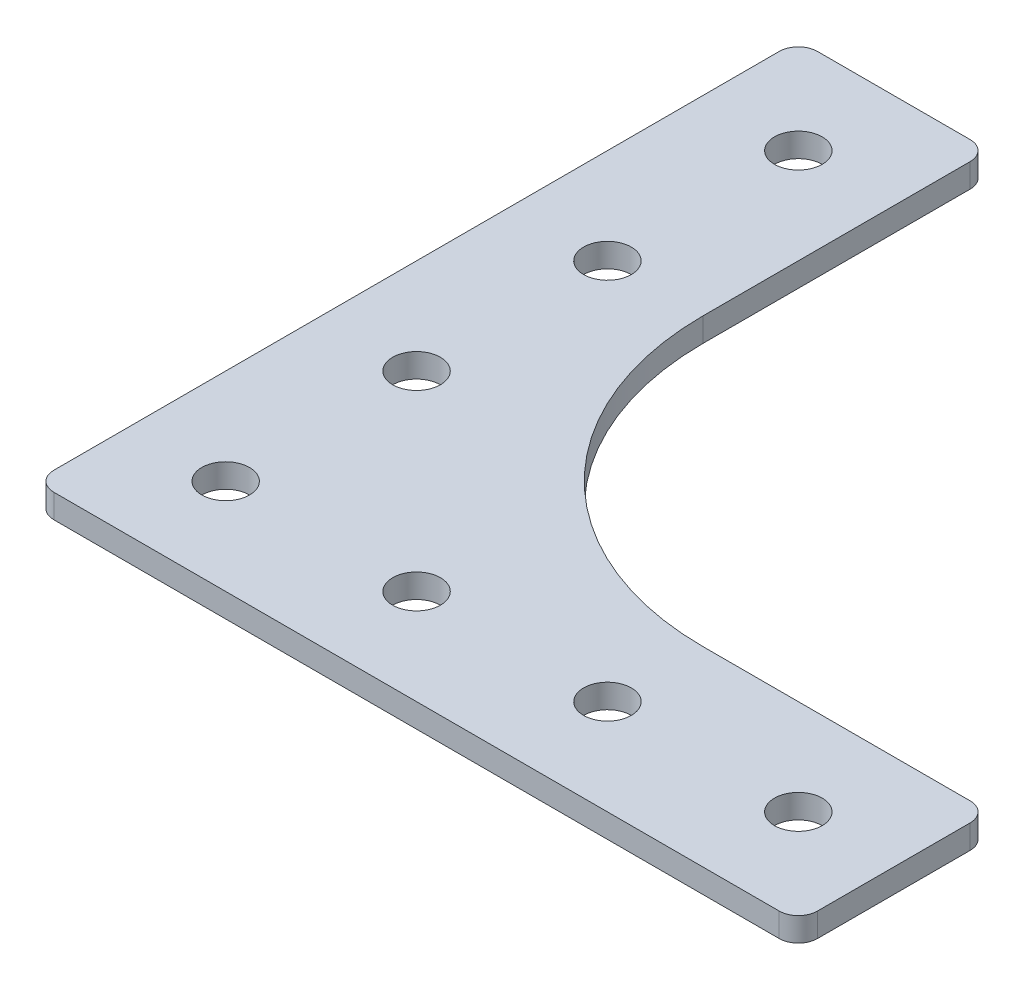
ISO-10303-21;
HEADER;
FILE_DESCRIPTION(('STEP AP214'),'2;1');
FILE_NAME('part.step','',(''),(''),'','','');
FILE_SCHEMA(('AUTOMOTIVE_DESIGN { 1 0 10303 214 1 1 1 1 }'));
ENDSEC;
DATA;
#1=APPLICATION_CONTEXT('core data for automotive mechanical design processes');
#2=APPLICATION_PROTOCOL_DEFINITION('international standard','automotive_design',2000,#1);
#3=PRODUCT_CONTEXT('',#1,'mechanical');
#4=PRODUCT('Part','Part','',(#3));
#5=PRODUCT_RELATED_PRODUCT_CATEGORY('part','',(#4));
#6=PRODUCT_DEFINITION_FORMATION('','',#4);
#7=PRODUCT_DEFINITION_CONTEXT('part definition',#1,'design');
#8=PRODUCT_DEFINITION('design','',#6,#7);
#9=PRODUCT_DEFINITION_SHAPE('','',#8);
#10=(LENGTH_UNIT() NAMED_UNIT(*) SI_UNIT(.MILLI.,.METRE.));
#11=(NAMED_UNIT(*) PLANE_ANGLE_UNIT() SI_UNIT($,.RADIAN.));
#12=(NAMED_UNIT(*) SI_UNIT($,.STERADIAN.) SOLID_ANGLE_UNIT());
#13=UNCERTAINTY_MEASURE_WITH_UNIT(LENGTH_MEASURE(1.E-05),#10,'distance_accuracy_value','');
#14=(GEOMETRIC_REPRESENTATION_CONTEXT(3) GLOBAL_UNCERTAINTY_ASSIGNED_CONTEXT((#13)) GLOBAL_UNIT_ASSIGNED_CONTEXT((#10,
#11,#12)) REPRESENTATION_CONTEXT('',''));
#15=CARTESIAN_POINT('',(0.,0.,0.));
#16=DIRECTION('',(0.,0.,1.));
#17=DIRECTION('',(1.,0.,0.));
#18=AXIS2_PLACEMENT_3D('',#15,#16,#17);
#19=CARTESIAN_POINT('',(-411.618028743073,3.175,343.64064623707));
#20=DIRECTION('',(0.,-1.,0.));
#21=DIRECTION('',(0.,0.,-1.));
#22=AXIS2_PLACEMENT_3D('',#19,#20,#21);
#23=PLANE('',#22);
#24=CARTESIAN_POINT('',(-421.778028743073,3.175,430.000646237071));
#25=DIRECTION('',(0.,1.,0.));
#26=DIRECTION('',(0.,0.,1.));
#27=AXIS2_PLACEMENT_3D('',#24,#25,#26);
#28=CIRCLE('',#27,3.17499999999998);
#29=CARTESIAN_POINT('',(-421.778028743073,3.175,433.175646237071));
#30=VERTEX_POINT('',#29);
#31=EDGE_CURVE('E353',#30,#30,#28,.T.);
#32=ORIENTED_EDGE('',*,*,#31,.F.);
#33=EDGE_LOOP('',(#32));
#34=FACE_BOUND('',#33,.T.);
#35=CARTESIAN_POINT('',(-396.378028743073,3.175,430.00064623707));
#36=DIRECTION('',(0.,1.,0.));
#37=DIRECTION('',(0.,0.,1.));
#38=AXIS2_PLACEMENT_3D('',#35,#36,#37);
#39=CIRCLE('',#38,3.17499999999998);
#40=CARTESIAN_POINT('',(-396.378028743073,3.175,433.17564623707));
#41=VERTEX_POINT('',#40);
#42=EDGE_CURVE('E359',#41,#41,#39,.T.);
#43=ORIENTED_EDGE('',*,*,#42,.F.);
#44=EDGE_LOOP('',(#43));
#45=FACE_BOUND('',#44,.T.);
#46=CARTESIAN_POINT('',(-421.778028743073,3.175,353.800646237071));
#47=DIRECTION('',(0.,1.,0.));
#48=DIRECTION('',(0.,0.,1.));
#49=AXIS2_PLACEMENT_3D('',#46,#47,#48);
#50=CIRCLE('',#49,3.17499999999998);
#51=CARTESIAN_POINT('',(-421.778028743073,3.175,356.975646237071));
#52=VERTEX_POINT('',#51);
#53=EDGE_CURVE('E377',#52,#52,#50,.T.);
#54=ORIENTED_EDGE('',*,*,#53,.F.);
#55=EDGE_LOOP('',(#54));
#56=FACE_BOUND('',#55,.T.);
#57=CARTESIAN_POINT('',(-421.778028743073,3.175,379.20064623707));
#58=DIRECTION('',(0.,1.,0.));
#59=DIRECTION('',(0.,0.,1.));
#60=AXIS2_PLACEMENT_3D('',#57,#58,#59);
#61=CIRCLE('',#60,3.17499999999998);
#62=CARTESIAN_POINT('',(-421.778028743073,3.175,382.37564623707));
#63=VERTEX_POINT('',#62);
#64=EDGE_CURVE('E385',#63,#63,#61,.T.);
#65=ORIENTED_EDGE('',*,*,#64,.F.);
#66=EDGE_LOOP('',(#65));
#67=FACE_BOUND('',#66,.T.);
#68=CARTESIAN_POINT('',(-370.978028743073,3.175,430.00064623707));
#69=DIRECTION('',(0.,1.,0.));
#70=DIRECTION('',(0.,0.,1.));
#71=AXIS2_PLACEMENT_3D('',#68,#69,#70);
#72=CIRCLE('',#71,3.17499999999998);
#73=CARTESIAN_POINT('',(-370.978028743073,3.175,433.17564623707));
#74=VERTEX_POINT('',#73);
#75=EDGE_CURVE('E393',#74,#74,#72,.T.);
#76=ORIENTED_EDGE('',*,*,#75,.F.);
#77=EDGE_LOOP('',(#76));
#78=FACE_BOUND('',#77,.T.);
#79=CARTESIAN_POINT('',(-345.578028743073,3.175,430.00064623707));
#80=DIRECTION('',(0.,1.,0.));
#81=DIRECTION('',(0.,0.,1.));
#82=AXIS2_PLACEMENT_3D('',#79,#80,#81);
#83=CIRCLE('',#82,3.17499999999998);
#84=CARTESIAN_POINT('',(-345.578028743073,3.175,433.17564623707));
#85=VERTEX_POINT('',#84);
#86=EDGE_CURVE('E401',#85,#85,#83,.T.);
#87=ORIENTED_EDGE('',*,*,#86,.F.);
#88=EDGE_LOOP('',(#87));
#89=FACE_BOUND('',#88,.T.);
#90=CARTESIAN_POINT('',(-411.618028743073,3.175,343.64064623707));
#91=DIRECTION('',(0.,1.,0.));
#92=DIRECTION('',(0.,0.,-1.));
#93=AXIS2_PLACEMENT_3D('',#90,#91,#92);
#94=CIRCLE('',#93,2.53999999999999);
#95=CARTESIAN_POINT('',(-409.078028743073,3.175,343.640646237071));
#96=VERTEX_POINT('',#95);
#97=CARTESIAN_POINT('',(-411.618028743073,3.175,341.10064623707));
#98=VERTEX_POINT('',#97);
#99=EDGE_CURVE('E217',#96,#98,#94,.T.);
#100=ORIENTED_EDGE('',*,*,#99,.T.);
#101=DIRECTION('',(-1.,0.,0.));
#102=VECTOR('',#101,1.);
#103=CARTESIAN_POINT('',(-431.938028743073,3.175,341.10064623707));
#104=LINE('',#103,#102);
#105=CARTESIAN_POINT('',(-431.938028743073,3.175,341.10064623707));
#106=VERTEX_POINT('',#105);
#107=EDGE_CURVE('E271',#98,#106,#104,.T.);
#108=ORIENTED_EDGE('',*,*,#107,.T.);
#109=CARTESIAN_POINT('',(-431.938028743073,3.175,343.64064623707));
#110=DIRECTION('',(0.,1.,0.));
#111=DIRECTION('',(0.,0.,-1.));
#112=AXIS2_PLACEMENT_3D('',#109,#110,#111);
#113=CIRCLE('',#112,2.53999999999999);
#114=CARTESIAN_POINT('',(-434.478028743073,3.175,343.640646237071));
#115=VERTEX_POINT('',#114);
#116=EDGE_CURVE('E250',#106,#115,#113,.T.);
#117=ORIENTED_EDGE('',*,*,#116,.T.);
#118=DIRECTION('',(0.,0.,1.));
#119=VECTOR('',#118,1.);
#120=CARTESIAN_POINT('',(-434.478028743073,3.175,440.16064623707));
#121=LINE('',#120,#119);
#122=CARTESIAN_POINT('',(-434.478028743073,3.175,440.16064623707));
#123=VERTEX_POINT('',#122);
#124=EDGE_CURVE('E266',#115,#123,#121,.T.);
#125=ORIENTED_EDGE('',*,*,#124,.T.);
#126=CARTESIAN_POINT('',(-431.938028743073,3.175,440.16064623707));
#127=DIRECTION('',(0.,1.,0.));
#128=DIRECTION('',(0.,0.,-1.));
#129=AXIS2_PLACEMENT_3D('',#126,#127,#128);
#130=CIRCLE('',#129,2.53999999999999);
#131=CARTESIAN_POINT('',(-431.938028743073,3.175,442.70064623707));
#132=VERTEX_POINT('',#131);
#133=EDGE_CURVE('E269',#123,#132,#130,.T.);
#134=ORIENTED_EDGE('',*,*,#133,.T.);
#135=DIRECTION('',(1.,0.,0.));
#136=VECTOR('',#135,1.);
#137=CARTESIAN_POINT('',(-431.938028743073,3.175,442.70064623707));
#138=LINE('',#137,#136);
#139=CARTESIAN_POINT('',(-335.418028743073,3.175,442.700646237069));
#140=VERTEX_POINT('',#139);
#141=EDGE_CURVE('E282',#132,#140,#138,.T.);
#142=ORIENTED_EDGE('',*,*,#141,.T.);
#143=CARTESIAN_POINT('',(-335.418028743073,3.175,440.160646237069));
#144=DIRECTION('',(0.,1.,0.));
#145=DIRECTION('',(0.,0.,1.));
#146=AXIS2_PLACEMENT_3D('',#143,#144,#145);
#147=CIRCLE('',#146,2.54000000000001);
#148=CARTESIAN_POINT('',(-332.878028743073,3.175,440.160646237069));
#149=VERTEX_POINT('',#148);
#150=EDGE_CURVE('E286',#140,#149,#147,.T.);
#151=ORIENTED_EDGE('',*,*,#150,.T.);
#152=DIRECTION('',(0.,0.,-1.));
#153=VECTOR('',#152,1.);
#154=CARTESIAN_POINT('',(-332.878028743073,3.175,440.160646237069));
#155=LINE('',#154,#153);
#156=CARTESIAN_POINT('',(-332.878028743073,3.175,419.84064623707));
#157=VERTEX_POINT('',#156);
#158=EDGE_CURVE('E167',#149,#157,#155,.T.);
#159=ORIENTED_EDGE('',*,*,#158,.T.);
#160=CARTESIAN_POINT('',(-335.418028743073,3.175,419.84064623707));
#161=DIRECTION('',(0.,1.,0.));
#162=DIRECTION('',(0.,0.,-1.));
#163=AXIS2_PLACEMENT_3D('',#160,#161,#162);
#164=CIRCLE('',#163,2.53999999999999);
#165=CARTESIAN_POINT('',(-335.418028743073,3.175,417.30064623707));
#166=VERTEX_POINT('',#165);
#167=EDGE_CURVE('E161',#157,#166,#164,.T.);
#168=ORIENTED_EDGE('',*,*,#167,.T.);
#169=DIRECTION('',(-1.,0.,0.));
#170=VECTOR('',#169,1.);
#171=CARTESIAN_POINT('',(-335.418028743073,3.175,417.30064623707));
#172=LINE('',#171,#170);
#173=CARTESIAN_POINT('',(-370.978028743073,3.175,417.30064623707));
#174=VERTEX_POINT('',#173);
#175=EDGE_CURVE('E141',#166,#174,#172,.T.);
#176=ORIENTED_EDGE('',*,*,#175,.T.);
#177=CARTESIAN_POINT('',(-370.978028743073,3.175,379.20064623707));
#178=DIRECTION('',(0.,-1.,0.));
#179=DIRECTION('',(0.,0.,1.));
#180=AXIS2_PLACEMENT_3D('',#177,#178,#179);
#181=CIRCLE('',#180,38.1);
#182=CARTESIAN_POINT('',(-409.078028743073,3.175,379.20064623707));
#183=VERTEX_POINT('',#182);
#184=EDGE_CURVE('E151',#174,#183,#181,.T.);
#185=ORIENTED_EDGE('',*,*,#184,.T.);
#186=DIRECTION('',(0.,0.,-1.));
#187=VECTOR('',#186,1.);
#188=CARTESIAN_POINT('',(-409.078028743073,3.175,379.20064623707));
#189=LINE('',#188,#187);
#190=EDGE_CURVE('E155',#183,#96,#189,.T.);
#191=ORIENTED_EDGE('',*,*,#190,.T.);
#192=EDGE_LOOP('',(#100,#108,#117,#125,#134,#142,#151,#159,#168,#176,#185,#191));
#193=FACE_BOUND('',#192,.T.);
#194=CARTESIAN_POINT('',(-421.778028743073,3.175,404.600646237071));
#195=DIRECTION('',(0.,1.,0.));
#196=DIRECTION('',(0.,0.,1.));
#197=AXIS2_PLACEMENT_3D('',#194,#195,#196);
#198=CIRCLE('',#197,3.17499999999998);
#199=CARTESIAN_POINT('',(-421.778028743073,3.175,407.775646237071));
#200=VERTEX_POINT('',#199);
#201=EDGE_CURVE('E369',#200,#200,#198,.T.);
#202=ORIENTED_EDGE('',*,*,#201,.F.);
#203=EDGE_LOOP('',(#202));
#204=FACE_BOUND('',#203,.T.);
#205=ADVANCED_FACE('F45',(#34,#45,#56,#67,#78,#89,#193,#204),#23,.F.);
#206=CARTESIAN_POINT('',(-411.618028743073,0.,343.64064623707));
#207=DIRECTION('',(0.,-1.,0.));
#208=DIRECTION('',(0.,0.,-1.));
#209=AXIS2_PLACEMENT_3D('',#206,#207,#208);
#210=PLANE('',#209);
#211=CARTESIAN_POINT('',(-421.778028743073,0.,430.000646237071));
#212=DIRECTION('',(0.,1.,0.));
#213=DIRECTION('',(0.,0.,1.));
#214=AXIS2_PLACEMENT_3D('',#211,#212,#213);
#215=CIRCLE('',#214,3.17499999999998);
#216=CARTESIAN_POINT('',(-421.778028743073,0.,433.175646237071));
#217=VERTEX_POINT('',#216);
#218=EDGE_CURVE('E351',#217,#217,#215,.T.);
#219=ORIENTED_EDGE('',*,*,#218,.T.);
#220=EDGE_LOOP('',(#219));
#221=FACE_BOUND('',#220,.T.);
#222=CARTESIAN_POINT('',(-396.378028743073,0.,430.00064623707));
#223=DIRECTION('',(0.,1.,0.));
#224=DIRECTION('',(0.,0.,1.));
#225=AXIS2_PLACEMENT_3D('',#222,#223,#224);
#226=CIRCLE('',#225,3.17499999999998);
#227=CARTESIAN_POINT('',(-396.378028743073,0.,433.17564623707));
#228=VERTEX_POINT('',#227);
#229=EDGE_CURVE('E365',#228,#228,#226,.T.);
#230=ORIENTED_EDGE('',*,*,#229,.T.);
#231=EDGE_LOOP('',(#230));
#232=FACE_BOUND('',#231,.T.);
#233=CARTESIAN_POINT('',(-421.778028743073,0.,404.600646237071));
#234=DIRECTION('',(0.,1.,0.));
#235=DIRECTION('',(0.,0.,1.));
#236=AXIS2_PLACEMENT_3D('',#233,#234,#235);
#237=CIRCLE('',#236,3.17499999999998);
#238=CARTESIAN_POINT('',(-421.778028743073,0.,407.775646237071));
#239=VERTEX_POINT('',#238);
#240=EDGE_CURVE('E373',#239,#239,#237,.T.);
#241=ORIENTED_EDGE('',*,*,#240,.T.);
#242=EDGE_LOOP('',(#241));
#243=FACE_BOUND('',#242,.T.);
#244=CARTESIAN_POINT('',(-421.778028743073,0.,353.800646237071));
#245=DIRECTION('',(0.,1.,0.));
#246=DIRECTION('',(0.,0.,1.));
#247=AXIS2_PLACEMENT_3D('',#244,#245,#246);
#248=CIRCLE('',#247,3.17499999999998);
#249=CARTESIAN_POINT('',(-421.778028743073,0.,356.975646237071));
#250=VERTEX_POINT('',#249);
#251=EDGE_CURVE('E381',#250,#250,#248,.T.);
#252=ORIENTED_EDGE('',*,*,#251,.T.);
#253=EDGE_LOOP('',(#252));
#254=FACE_BOUND('',#253,.T.);
#255=CARTESIAN_POINT('',(-411.618028743073,0.,343.64064623707));
#256=DIRECTION('',(0.,1.,0.));
#257=DIRECTION('',(0.,0.,-1.));
#258=AXIS2_PLACEMENT_3D('',#255,#256,#257);
#259=CIRCLE('',#258,2.53999999999999);
#260=CARTESIAN_POINT('',(-409.078028743073,0.,343.640646237071));
#261=VERTEX_POINT('',#260);
#262=CARTESIAN_POINT('',(-411.618028743073,0.,341.10064623707));
#263=VERTEX_POINT('',#262);
#264=EDGE_CURVE('E173',#261,#263,#259,.T.);
#265=ORIENTED_EDGE('',*,*,#264,.F.);
#266=DIRECTION('',(0.,0.,-1.));
#267=VECTOR('',#266,1.);
#268=CARTESIAN_POINT('',(-409.078028743073,0.,379.20064623707));
#269=LINE('',#268,#267);
#270=CARTESIAN_POINT('',(-409.078028743073,0.,379.20064623707));
#271=VERTEX_POINT('',#270);
#272=EDGE_CURVE('E214',#271,#261,#269,.T.);
#273=ORIENTED_EDGE('',*,*,#272,.F.);
#274=CARTESIAN_POINT('',(-370.978028743073,0.,379.20064623707));
#275=DIRECTION('',(0.,-1.,0.));
#276=DIRECTION('',(0.,0.,1.));
#277=AXIS2_PLACEMENT_3D('',#274,#275,#276);
#278=CIRCLE('',#277,38.1);
#279=CARTESIAN_POINT('',(-370.978028743073,0.,417.30064623707));
#280=VERTEX_POINT('',#279);
#281=EDGE_CURVE('E211',#280,#271,#278,.T.);
#282=ORIENTED_EDGE('',*,*,#281,.F.);
#283=DIRECTION('',(-1.,0.,0.));
#284=VECTOR('',#283,1.);
#285=CARTESIAN_POINT('',(-335.418028743073,0.,417.30064623707));
#286=LINE('',#285,#284);
#287=CARTESIAN_POINT('',(-335.418028743073,0.,417.30064623707));
#288=VERTEX_POINT('',#287);
#289=EDGE_CURVE('E144',#288,#280,#286,.T.);
#290=ORIENTED_EDGE('',*,*,#289,.F.);
#291=CARTESIAN_POINT('',(-335.418028743073,0.,419.84064623707));
#292=DIRECTION('',(0.,1.,0.));
#293=DIRECTION('',(0.,0.,-1.));
#294=AXIS2_PLACEMENT_3D('',#291,#292,#293);
#295=CIRCLE('',#294,2.53999999999999);
#296=CARTESIAN_POINT('',(-332.878028743073,0.,419.84064623707));
#297=VERTEX_POINT('',#296);
#298=EDGE_CURVE('E205',#297,#288,#295,.T.);
#299=ORIENTED_EDGE('',*,*,#298,.F.);
#300=DIRECTION('',(0.,0.,-1.));
#301=VECTOR('',#300,1.);
#302=CARTESIAN_POINT('',(-332.878028743073,0.,440.160646237069));
#303=LINE('',#302,#301);
#304=CARTESIAN_POINT('',(-332.878028743073,0.,440.160646237069));
#305=VERTEX_POINT('',#304);
#306=EDGE_CURVE('E201',#305,#297,#303,.T.);
#307=ORIENTED_EDGE('',*,*,#306,.F.);
#308=CARTESIAN_POINT('',(-335.418028743073,0.,440.160646237069));
#309=DIRECTION('',(0.,1.,0.));
#310=DIRECTION('',(0.,0.,1.));
#311=AXIS2_PLACEMENT_3D('',#308,#309,#310);
#312=CIRCLE('',#311,2.54000000000001);
#313=CARTESIAN_POINT('',(-335.418028743073,0.,442.700646237069));
#314=VERTEX_POINT('',#313);
#315=EDGE_CURVE('E197',#314,#305,#312,.T.);
#316=ORIENTED_EDGE('',*,*,#315,.F.);
#317=DIRECTION('',(1.,0.,0.));
#318=VECTOR('',#317,1.);
#319=CARTESIAN_POINT('',(-431.938028743073,0.,442.70064623707));
#320=LINE('',#319,#318);
#321=CARTESIAN_POINT('',(-431.938028743073,0.,442.70064623707));
#322=VERTEX_POINT('',#321);
#323=EDGE_CURVE('E193',#322,#314,#320,.T.);
#324=ORIENTED_EDGE('',*,*,#323,.F.);
#325=CARTESIAN_POINT('',(-431.938028743073,0.,440.16064623707));
#326=DIRECTION('',(0.,1.,0.));
#327=DIRECTION('',(0.,0.,-1.));
#328=AXIS2_PLACEMENT_3D('',#325,#326,#327);
#329=CIRCLE('',#328,2.53999999999999);
#330=CARTESIAN_POINT('',(-434.478028743073,0.,440.16064623707));
#331=VERTEX_POINT('',#330);
#332=EDGE_CURVE('E189',#331,#322,#329,.T.);
#333=ORIENTED_EDGE('',*,*,#332,.F.);
#334=DIRECTION('',(0.,0.,1.));
#335=VECTOR('',#334,1.);
#336=CARTESIAN_POINT('',(-434.478028743073,0.,440.16064623707));
#337=LINE('',#336,#335);
#338=CARTESIAN_POINT('',(-434.478028743073,0.,343.640646237071));
#339=VERTEX_POINT('',#338);
#340=EDGE_CURVE('E185',#339,#331,#337,.T.);
#341=ORIENTED_EDGE('',*,*,#340,.F.);
#342=CARTESIAN_POINT('',(-431.938028743073,0.,343.64064623707));
#343=DIRECTION('',(0.,1.,0.));
#344=DIRECTION('',(0.,0.,-1.));
#345=AXIS2_PLACEMENT_3D('',#342,#343,#344);
#346=CIRCLE('',#345,2.53999999999999);
#347=CARTESIAN_POINT('',(-431.938028743073,0.,341.10064623707));
#348=VERTEX_POINT('',#347);
#349=EDGE_CURVE('E181',#348,#339,#346,.T.);
#350=ORIENTED_EDGE('',*,*,#349,.F.);
#351=DIRECTION('',(-1.,0.,0.));
#352=VECTOR('',#351,1.);
#353=CARTESIAN_POINT('',(-431.938028743073,0.,341.10064623707));
#354=LINE('',#353,#352);
#355=EDGE_CURVE('E176',#263,#348,#354,.T.);
#356=ORIENTED_EDGE('',*,*,#355,.F.);
#357=EDGE_LOOP('',(#265,#273,#282,#290,#299,#307,#316,#324,#333,#341,#350,#356));
#358=FACE_BOUND('',#357,.T.);
#359=CARTESIAN_POINT('',(-345.578028743073,0.,430.00064623707));
#360=DIRECTION('',(0.,1.,0.));
#361=DIRECTION('',(0.,0.,1.));
#362=AXIS2_PLACEMENT_3D('',#359,#360,#361);
#363=CIRCLE('',#362,3.17499999999998);
#364=CARTESIAN_POINT('',(-345.578028743073,0.,433.17564623707));
#365=VERTEX_POINT('',#364);
#366=EDGE_CURVE('E177',#365,#365,#363,.T.);
#367=ORIENTED_EDGE('',*,*,#366,.T.);
#368=EDGE_LOOP('',(#367));
#369=FACE_BOUND('',#368,.T.);
#370=CARTESIAN_POINT('',(-370.978028743073,0.,430.00064623707));
#371=DIRECTION('',(0.,1.,0.));
#372=DIRECTION('',(0.,0.,1.));
#373=AXIS2_PLACEMENT_3D('',#370,#371,#372);
#374=CIRCLE('',#373,3.17499999999998);
#375=CARTESIAN_POINT('',(-370.978028743073,0.,433.17564623707));
#376=VERTEX_POINT('',#375);
#377=EDGE_CURVE('E397',#376,#376,#374,.T.);
#378=ORIENTED_EDGE('',*,*,#377,.T.);
#379=EDGE_LOOP('',(#378));
#380=FACE_BOUND('',#379,.T.);
#381=CARTESIAN_POINT('',(-421.778028743073,0.,379.20064623707));
#382=DIRECTION('',(0.,1.,0.));
#383=DIRECTION('',(0.,0.,1.));
#384=AXIS2_PLACEMENT_3D('',#381,#382,#383);
#385=CIRCLE('',#384,3.17499999999998);
#386=CARTESIAN_POINT('',(-421.778028743073,0.,382.37564623707));
#387=VERTEX_POINT('',#386);
#388=EDGE_CURVE('E389',#387,#387,#385,.T.);
#389=ORIENTED_EDGE('',*,*,#388,.T.);
#390=EDGE_LOOP('',(#389));
#391=FACE_BOUND('',#390,.T.);
#392=ADVANCED_FACE('F257',(#221,#232,#243,#254,#358,#369,#380,#391),#210,.T.);
#393=CARTESIAN_POINT('',(-411.618028743073,3.175,343.64064623707));
#394=DIRECTION('',(0.,-1.,0.));
#395=DIRECTION('',(0.,0.,-1.));
#396=AXIS2_PLACEMENT_3D('',#393,#394,#395);
#397=CYLINDRICAL_SURFACE('',#396,2.53999999999999);
#398=ORIENTED_EDGE('',*,*,#264,.T.);
#399=DIRECTION('',(0.,-1.,0.));
#400=VECTOR('',#399,1.);
#401=CARTESIAN_POINT('',(-411.618028743073,3.175,341.10064623707));
#402=LINE('',#401,#400);
#403=EDGE_CURVE('E11',#98,#263,#402,.T.);
#404=ORIENTED_EDGE('',*,*,#403,.F.);
#405=ORIENTED_EDGE('',*,*,#99,.F.);
#406=DIRECTION('',(0.,-1.,0.));
#407=VECTOR('',#406,1.);
#408=CARTESIAN_POINT('',(-409.078028743073,3.175,343.640646237071));
#409=LINE('',#408,#407);
#410=EDGE_CURVE('E63',#96,#261,#409,.T.);
#411=ORIENTED_EDGE('',*,*,#410,.T.);
#412=EDGE_LOOP('',(#398,#404,#405,#411));
#413=FACE_BOUND('',#412,.T.);
#414=ADVANCED_FACE('F47',(#413),#397,.T.);
#415=CARTESIAN_POINT('',(-431.938028743073,3.175,341.10064623707));
#416=DIRECTION('',(0.,0.,1.));
#417=DIRECTION('',(1.,0.,0.));
#418=AXIS2_PLACEMENT_3D('',#415,#416,#417);
#419=PLANE('',#418);
#420=ORIENTED_EDGE('',*,*,#355,.T.);
#421=DIRECTION('',(0.,-1.,0.));
#422=VECTOR('',#421,1.);
#423=CARTESIAN_POINT('',(-431.938028743073,3.175,341.10064623707));
#424=LINE('',#423,#422);
#425=EDGE_CURVE('E55',#106,#348,#424,.T.);
#426=ORIENTED_EDGE('',*,*,#425,.F.);
#427=ORIENTED_EDGE('',*,*,#107,.F.);
#428=ORIENTED_EDGE('',*,*,#403,.T.);
#429=EDGE_LOOP('',(#420,#426,#427,#428));
#430=FACE_BOUND('',#429,.T.);
#431=ADVANCED_FACE('F254',(#430),#419,.F.);
#432=CARTESIAN_POINT('',(-431.938028743073,3.175,343.64064623707));
#433=DIRECTION('',(0.,-1.,0.));
#434=DIRECTION('',(0.,0.,-1.));
#435=AXIS2_PLACEMENT_3D('',#432,#433,#434);
#436=CYLINDRICAL_SURFACE('',#435,2.53999999999999);
#437=ORIENTED_EDGE('',*,*,#349,.T.);
#438=DIRECTION('',(0.,-1.,0.));
#439=VECTOR('',#438,1.);
#440=CARTESIAN_POINT('',(-434.478028743073,3.175,343.640646237071));
#441=LINE('',#440,#439);
#442=EDGE_CURVE('E239',#115,#339,#441,.T.);
#443=ORIENTED_EDGE('',*,*,#442,.F.);
#444=ORIENTED_EDGE('',*,*,#116,.F.);
#445=ORIENTED_EDGE('',*,*,#425,.T.);
#446=EDGE_LOOP('',(#437,#443,#444,#445));
#447=FACE_BOUND('',#446,.T.);
#448=ADVANCED_FACE('F246',(#447),#436,.T.);
#449=CARTESIAN_POINT('',(-434.478028743073,3.175,440.16064623707));
#450=DIRECTION('',(1.,0.,0.));
#451=DIRECTION('',(0.,0.,-1.));
#452=AXIS2_PLACEMENT_3D('',#449,#450,#451);
#453=PLANE('',#452);
#454=ORIENTED_EDGE('',*,*,#340,.T.);
#455=DIRECTION('',(0.,-1.,0.));
#456=VECTOR('',#455,1.);
#457=CARTESIAN_POINT('',(-434.478028743073,3.175,440.16064623707));
#458=LINE('',#457,#456);
#459=EDGE_CURVE('E236',#123,#331,#458,.T.);
#460=ORIENTED_EDGE('',*,*,#459,.F.);
#461=ORIENTED_EDGE('',*,*,#124,.F.);
#462=ORIENTED_EDGE('',*,*,#442,.T.);
#463=EDGE_LOOP('',(#454,#460,#461,#462));
#464=FACE_BOUND('',#463,.T.);
#465=ADVANCED_FACE('F262',(#464),#453,.F.);
#466=CARTESIAN_POINT('',(-431.938028743073,3.175,440.16064623707));
#467=DIRECTION('',(0.,-1.,0.));
#468=DIRECTION('',(0.,0.,-1.));
#469=AXIS2_PLACEMENT_3D('',#466,#467,#468);
#470=CYLINDRICAL_SURFACE('',#469,2.53999999999999);
#471=ORIENTED_EDGE('',*,*,#332,.T.);
#472=DIRECTION('',(0.,-1.,0.));
#473=VECTOR('',#472,1.);
#474=CARTESIAN_POINT('',(-431.938028743073,3.175,442.70064623707));
#475=LINE('',#474,#473);
#476=EDGE_CURVE('E233',#132,#322,#475,.T.);
#477=ORIENTED_EDGE('',*,*,#476,.F.);
#478=ORIENTED_EDGE('',*,*,#133,.F.);
#479=ORIENTED_EDGE('',*,*,#459,.T.);
#480=EDGE_LOOP('',(#471,#477,#478,#479));
#481=FACE_BOUND('',#480,.T.);
#482=ADVANCED_FACE('F421',(#481),#470,.T.);
#483=CARTESIAN_POINT('',(-431.938028743073,3.175,442.70064623707));
#484=DIRECTION('',(0.,0.,-1.));
#485=DIRECTION('',(-1.,0.,0.));
#486=AXIS2_PLACEMENT_3D('',#483,#484,#485);
#487=PLANE('',#486);
#488=ORIENTED_EDGE('',*,*,#323,.T.);
#489=DIRECTION('',(0.,-1.,0.));
#490=VECTOR('',#489,1.);
#491=CARTESIAN_POINT('',(-335.418028743073,3.175,442.700646237069));
#492=LINE('',#491,#490);
#493=EDGE_CURVE('E230',#140,#314,#492,.T.);
#494=ORIENTED_EDGE('',*,*,#493,.F.);
#495=ORIENTED_EDGE('',*,*,#141,.F.);
#496=ORIENTED_EDGE('',*,*,#476,.T.);
#497=EDGE_LOOP('',(#488,#494,#495,#496));
#498=FACE_BOUND('',#497,.T.);
#499=ADVANCED_FACE('F424',(#498),#487,.F.);
#500=CARTESIAN_POINT('',(-335.418028743073,3.175,440.160646237069));
#501=DIRECTION('',(0.,-1.,0.));
#502=DIRECTION('',(0.,0.,-1.));
#503=AXIS2_PLACEMENT_3D('',#500,#501,#502);
#504=CYLINDRICAL_SURFACE('',#503,2.54000000000001);
#505=ORIENTED_EDGE('',*,*,#315,.T.);
#506=DIRECTION('',(0.,-1.,0.));
#507=VECTOR('',#506,1.);
#508=CARTESIAN_POINT('',(-332.878028743073,3.175,440.160646237069));
#509=LINE('',#508,#507);
#510=EDGE_CURVE('E227',#149,#305,#509,.T.);
#511=ORIENTED_EDGE('',*,*,#510,.F.);
#512=ORIENTED_EDGE('',*,*,#150,.F.);
#513=ORIENTED_EDGE('',*,*,#493,.T.);
#514=EDGE_LOOP('',(#505,#511,#512,#513));
#515=FACE_BOUND('',#514,.T.);
#516=ADVANCED_FACE('F428',(#515),#504,.T.);
#517=CARTESIAN_POINT('',(-332.878028743073,3.175,440.160646237069));
#518=DIRECTION('',(-1.,0.,0.));
#519=DIRECTION('',(0.,0.,1.));
#520=AXIS2_PLACEMENT_3D('',#517,#518,#519);
#521=PLANE('',#520);
#522=ORIENTED_EDGE('',*,*,#306,.T.);
#523=DIRECTION('',(0.,-1.,0.));
#524=VECTOR('',#523,1.);
#525=CARTESIAN_POINT('',(-332.878028743073,3.175,419.84064623707));
#526=LINE('',#525,#524);
#527=EDGE_CURVE('E224',#157,#297,#526,.T.);
#528=ORIENTED_EDGE('',*,*,#527,.F.);
#529=ORIENTED_EDGE('',*,*,#158,.F.);
#530=ORIENTED_EDGE('',*,*,#510,.T.);
#531=EDGE_LOOP('',(#522,#528,#529,#530));
#532=FACE_BOUND('',#531,.T.);
#533=ADVANCED_FACE('F295',(#532),#521,.F.);
#534=CARTESIAN_POINT('',(-335.418028743073,3.175,419.84064623707));
#535=DIRECTION('',(0.,-1.,0.));
#536=DIRECTION('',(0.,0.,-1.));
#537=AXIS2_PLACEMENT_3D('',#534,#535,#536);
#538=CYLINDRICAL_SURFACE('',#537,2.53999999999999);
#539=ORIENTED_EDGE('',*,*,#298,.T.);
#540=DIRECTION('',(0.,-1.,0.));
#541=VECTOR('',#540,1.);
#542=CARTESIAN_POINT('',(-335.418028743073,3.175,417.30064623707));
#543=LINE('',#542,#541);
#544=EDGE_CURVE('E148',#166,#288,#543,.T.);
#545=ORIENTED_EDGE('',*,*,#544,.F.);
#546=ORIENTED_EDGE('',*,*,#167,.F.);
#547=ORIENTED_EDGE('',*,*,#527,.T.);
#548=EDGE_LOOP('',(#539,#545,#546,#547));
#549=FACE_BOUND('',#548,.T.);
#550=ADVANCED_FACE('F299',(#549),#538,.T.);
#551=CARTESIAN_POINT('',(-335.418028743073,3.175,417.30064623707));
#552=DIRECTION('',(0.,0.,1.));
#553=DIRECTION('',(1.,0.,0.));
#554=AXIS2_PLACEMENT_3D('',#551,#552,#553);
#555=PLANE('',#554);
#556=ORIENTED_EDGE('',*,*,#289,.T.);
#557=DIRECTION('',(0.,-1.,0.));
#558=VECTOR('',#557,1.);
#559=CARTESIAN_POINT('',(-370.978028743073,3.175,417.30064623707));
#560=LINE('',#559,#558);
#561=EDGE_CURVE('E137',#174,#280,#560,.T.);
#562=ORIENTED_EDGE('',*,*,#561,.F.);
#563=ORIENTED_EDGE('',*,*,#175,.F.);
#564=ORIENTED_EDGE('',*,*,#544,.T.);
#565=EDGE_LOOP('',(#556,#562,#563,#564));
#566=FACE_BOUND('',#565,.T.);
#567=ADVANCED_FACE('F139',(#566),#555,.F.);
#568=CARTESIAN_POINT('',(-370.978028743073,3.175,379.20064623707));
#569=DIRECTION('',(0.,-1.,0.));
#570=DIRECTION('',(0.,0.,-1.));
#571=AXIS2_PLACEMENT_3D('',#568,#569,#570);
#572=CYLINDRICAL_SURFACE('',#571,38.1);
#573=ORIENTED_EDGE('',*,*,#281,.T.);
#574=DIRECTION('',(0.,-1.,0.));
#575=VECTOR('',#574,1.);
#576=CARTESIAN_POINT('',(-409.078028743073,3.175,379.20064623707));
#577=LINE('',#576,#575);
#578=EDGE_CURVE('E100',#183,#271,#577,.T.);
#579=ORIENTED_EDGE('',*,*,#578,.F.);
#580=ORIENTED_EDGE('',*,*,#184,.F.);
#581=ORIENTED_EDGE('',*,*,#561,.T.);
#582=EDGE_LOOP('',(#573,#579,#580,#581));
#583=FACE_BOUND('',#582,.T.);
#584=ADVANCED_FACE('F152',(#583),#572,.F.);
#585=CARTESIAN_POINT('',(-409.078028743073,3.175,379.20064623707));
#586=DIRECTION('',(-1.,0.,0.));
#587=DIRECTION('',(0.,0.,1.));
#588=AXIS2_PLACEMENT_3D('',#585,#586,#587);
#589=PLANE('',#588);
#590=ORIENTED_EDGE('',*,*,#272,.T.);
#591=ORIENTED_EDGE('',*,*,#410,.F.);
#592=ORIENTED_EDGE('',*,*,#190,.F.);
#593=ORIENTED_EDGE('',*,*,#578,.T.);
#594=EDGE_LOOP('',(#590,#591,#592,#593));
#595=FACE_BOUND('',#594,.T.);
#596=ADVANCED_FACE('F301',(#595),#589,.F.);
#597=CARTESIAN_POINT('',(-345.578028743073,3.175,430.00064623707));
#598=DIRECTION('',(0.,1.,0.));
#599=DIRECTION('',(0.,0.,1.));
#600=AXIS2_PLACEMENT_3D('',#597,#598,#599);
#601=CYLINDRICAL_SURFACE('',#600,3.17499999999998);
#602=ORIENTED_EDGE('',*,*,#366,.F.);
#603=EDGE_LOOP('',(#602));
#604=FACE_BOUND('',#603,.T.);
#605=ORIENTED_EDGE('',*,*,#86,.T.);
#606=EDGE_LOOP('',(#605));
#607=FACE_BOUND('',#606,.T.);
#608=ADVANCED_FACE('F303',(#604,#607),#601,.F.);
#609=CARTESIAN_POINT('',(-370.978028743073,3.175,430.00064623707));
#610=DIRECTION('',(0.,1.,0.));
#611=DIRECTION('',(0.,0.,1.));
#612=AXIS2_PLACEMENT_3D('',#609,#610,#611);
#613=CYLINDRICAL_SURFACE('',#612,3.17499999999998);
#614=ORIENTED_EDGE('',*,*,#377,.F.);
#615=EDGE_LOOP('',(#614));
#616=FACE_BOUND('',#615,.T.);
#617=ORIENTED_EDGE('',*,*,#75,.T.);
#618=EDGE_LOOP('',(#617));
#619=FACE_BOUND('',#618,.T.);
#620=ADVANCED_FACE('F309',(#616,#619),#613,.F.);
#621=CARTESIAN_POINT('',(-421.778028743073,3.175,379.20064623707));
#622=DIRECTION('',(0.,1.,0.));
#623=DIRECTION('',(0.,0.,1.));
#624=AXIS2_PLACEMENT_3D('',#621,#622,#623);
#625=CYLINDRICAL_SURFACE('',#624,3.17499999999998);
#626=ORIENTED_EDGE('',*,*,#388,.F.);
#627=EDGE_LOOP('',(#626));
#628=FACE_BOUND('',#627,.T.);
#629=ORIENTED_EDGE('',*,*,#64,.T.);
#630=EDGE_LOOP('',(#629));
#631=FACE_BOUND('',#630,.T.);
#632=ADVANCED_FACE('F326',(#628,#631),#625,.F.);
#633=CARTESIAN_POINT('',(-421.778028743073,3.175,353.800646237071));
#634=DIRECTION('',(0.,1.,0.));
#635=DIRECTION('',(0.,0.,1.));
#636=AXIS2_PLACEMENT_3D('',#633,#634,#635);
#637=CYLINDRICAL_SURFACE('',#636,3.17499999999998);
#638=ORIENTED_EDGE('',*,*,#251,.F.);
#639=EDGE_LOOP('',(#638));
#640=FACE_BOUND('',#639,.T.);
#641=ORIENTED_EDGE('',*,*,#53,.T.);
#642=EDGE_LOOP('',(#641));
#643=FACE_BOUND('',#642,.T.);
#644=ADVANCED_FACE('F330',(#640,#643),#637,.F.);
#645=CARTESIAN_POINT('',(-421.778028743073,3.175,404.600646237071));
#646=DIRECTION('',(0.,1.,0.));
#647=DIRECTION('',(0.,0.,1.));
#648=AXIS2_PLACEMENT_3D('',#645,#646,#647);
#649=CYLINDRICAL_SURFACE('',#648,3.17499999999998);
#650=ORIENTED_EDGE('',*,*,#240,.F.);
#651=EDGE_LOOP('',(#650));
#652=FACE_BOUND('',#651,.T.);
#653=ORIENTED_EDGE('',*,*,#201,.T.);
#654=EDGE_LOOP('',(#653));
#655=FACE_BOUND('',#654,.T.);
#656=ADVANCED_FACE('F334',(#652,#655),#649,.F.);
#657=CARTESIAN_POINT('',(-396.378028743073,3.175,430.00064623707));
#658=DIRECTION('',(0.,1.,0.));
#659=DIRECTION('',(0.,0.,1.));
#660=AXIS2_PLACEMENT_3D('',#657,#658,#659);
#661=CYLINDRICAL_SURFACE('',#660,3.17499999999998);
#662=ORIENTED_EDGE('',*,*,#229,.F.);
#663=EDGE_LOOP('',(#662));
#664=FACE_BOUND('',#663,.T.);
#665=ORIENTED_EDGE('',*,*,#42,.T.);
#666=EDGE_LOOP('',(#665));
#667=FACE_BOUND('',#666,.T.);
#668=ADVANCED_FACE('F338',(#664,#667),#661,.F.);
#669=CARTESIAN_POINT('',(-421.778028743073,3.175,430.000646237071));
#670=DIRECTION('',(0.,1.,0.));
#671=DIRECTION('',(0.,0.,1.));
#672=AXIS2_PLACEMENT_3D('',#669,#670,#671);
#673=CYLINDRICAL_SURFACE('',#672,3.17499999999998);
#674=ORIENTED_EDGE('',*,*,#218,.F.);
#675=EDGE_LOOP('',(#674));
#676=FACE_BOUND('',#675,.T.);
#677=ORIENTED_EDGE('',*,*,#31,.T.);
#678=EDGE_LOOP('',(#677));
#679=FACE_BOUND('',#678,.T.);
#680=ADVANCED_FACE('F342',(#676,#679),#673,.F.);
#681=CLOSED_SHELL('',(#205,#392,#414,#431,#448,#465,#482,#499,#516,#533,#550,#567,#584,#596,
#608,#620,#632,#644,#656,#668,#680));
#682=MANIFOLD_SOLID_BREP('B2',#681);
#683=ADVANCED_BREP_SHAPE_REPRESENTATION('',(#18,#682),#14);
#684=SHAPE_DEFINITION_REPRESENTATION(#9,#683);
ENDSEC;
END-ISO-10303-21;
